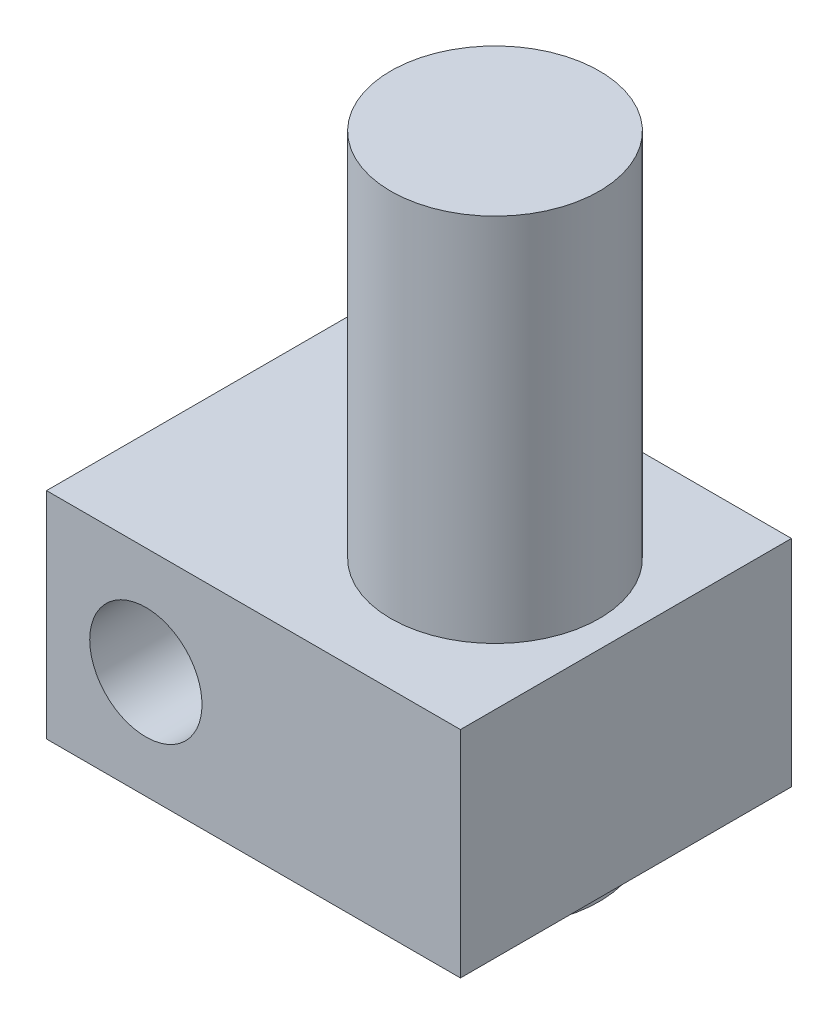
ISO-10303-21;
HEADER;
FILE_DESCRIPTION(('STEP AP214'),'2;1');
FILE_NAME('part.step','',(''),(''),'','','');
FILE_SCHEMA(('AUTOMOTIVE_DESIGN { 1 0 10303 214 1 1 1 1 }'));
ENDSEC;
DATA;
#1=APPLICATION_CONTEXT('core data for automotive mechanical design processes');
#2=APPLICATION_PROTOCOL_DEFINITION('international standard','automotive_design',2000,#1);
#3=PRODUCT_CONTEXT('',#1,'mechanical');
#4=PRODUCT('Part','Part','',(#3));
#5=PRODUCT_RELATED_PRODUCT_CATEGORY('part','',(#4));
#6=PRODUCT_DEFINITION_FORMATION('','',#4);
#7=PRODUCT_DEFINITION_CONTEXT('part definition',#1,'design');
#8=PRODUCT_DEFINITION('design','',#6,#7);
#9=PRODUCT_DEFINITION_SHAPE('','',#8);
#10=(LENGTH_UNIT() NAMED_UNIT(*) SI_UNIT(.MILLI.,.METRE.));
#11=(NAMED_UNIT(*) PLANE_ANGLE_UNIT() SI_UNIT($,.RADIAN.));
#12=(NAMED_UNIT(*) SI_UNIT($,.STERADIAN.) SOLID_ANGLE_UNIT());
#13=UNCERTAINTY_MEASURE_WITH_UNIT(LENGTH_MEASURE(1.E-05),#10,'distance_accuracy_value','');
#14=(GEOMETRIC_REPRESENTATION_CONTEXT(3) GLOBAL_UNCERTAINTY_ASSIGNED_CONTEXT((#13)) GLOBAL_UNIT_ASSIGNED_CONTEXT((#10,
#11,#12)) REPRESENTATION_CONTEXT('',''));
#15=CARTESIAN_POINT('',(0.,0.,0.));
#16=DIRECTION('',(0.,0.,1.));
#17=DIRECTION('',(1.,0.,0.));
#18=AXIS2_PLACEMENT_3D('',#15,#16,#17);
#19=CARTESIAN_POINT('',(7.94,8.255,-6.35));
#20=DIRECTION('',(-1.,0.,0.));
#21=DIRECTION('',(0.,0.,1.));
#22=AXIS2_PLACEMENT_3D('',#19,#20,#21);
#23=PLANE('',#22);
#24=DIRECTION('',(0.,0.,-1.));
#25=VECTOR('',#24,1.);
#26=CARTESIAN_POINT('',(7.94,0.,-6.35));
#27=LINE('',#26,#25);
#28=CARTESIAN_POINT('',(7.94,0.,6.35));
#29=VERTEX_POINT('',#28);
#30=CARTESIAN_POINT('',(7.94,0.,-6.35));
#31=VERTEX_POINT('',#30);
#32=EDGE_CURVE('E101',#29,#31,#27,.T.);
#33=ORIENTED_EDGE('',*,*,#32,.T.);
#34=DIRECTION('',(0.,-1.,0.));
#35=VECTOR('',#34,1.);
#36=CARTESIAN_POINT('',(7.94,8.255,-6.35));
#37=LINE('',#36,#35);
#38=CARTESIAN_POINT('',(7.94,8.255,-6.35));
#39=VERTEX_POINT('',#38);
#40=EDGE_CURVE('E92',#39,#31,#37,.T.);
#41=ORIENTED_EDGE('',*,*,#40,.F.);
#42=DIRECTION('',(0.,0.,-1.));
#43=VECTOR('',#42,1.);
#44=CARTESIAN_POINT('',(7.94,8.255,-6.35));
#45=LINE('',#44,#43);
#46=CARTESIAN_POINT('',(7.94,8.255,6.35));
#47=VERTEX_POINT('',#46);
#48=EDGE_CURVE('E86',#47,#39,#45,.T.);
#49=ORIENTED_EDGE('',*,*,#48,.F.);
#50=DIRECTION('',(0.,-1.,0.));
#51=VECTOR('',#50,1.);
#52=CARTESIAN_POINT('',(7.94,8.255,6.35));
#53=LINE('',#52,#51);
#54=EDGE_CURVE('E97',#47,#29,#53,.T.);
#55=ORIENTED_EDGE('',*,*,#54,.T.);
#56=EDGE_LOOP('',(#33,#41,#49,#55));
#57=FACE_BOUND('',#56,.T.);
#58=ADVANCED_FACE('F33',(#57),#23,.F.);
#59=CARTESIAN_POINT('',(-7.94,8.255,-6.35));
#60=DIRECTION('',(0.,0.,1.));
#61=DIRECTION('',(1.,0.,0.));
#62=AXIS2_PLACEMENT_3D('',#59,#60,#61);
#63=PLANE('',#62);
#64=CARTESIAN_POINT('',(-4.13,4.1275,-6.35));
#65=DIRECTION('',(0.,0.,-1.));
#66=DIRECTION('',(-1.,0.,0.));
#67=AXIS2_PLACEMENT_3D('',#64,#65,#66);
#68=CIRCLE('',#67,2.1533637066541);
#69=CARTESIAN_POINT('',(-6.28336370665411,4.1275,-6.35));
#70=VERTEX_POINT('',#69);
#71=EDGE_CURVE('E128',#70,#70,#68,.T.);
#72=ORIENTED_EDGE('',*,*,#71,.F.);
#73=EDGE_LOOP('',(#72));
#74=FACE_BOUND('',#73,.T.);
#75=DIRECTION('',(-1.,0.,0.));
#76=VECTOR('',#75,1.);
#77=CARTESIAN_POINT('',(-7.94,0.,-6.35));
#78=LINE('',#77,#76);
#79=CARTESIAN_POINT('',(-7.94,0.,-6.35));
#80=VERTEX_POINT('',#79);
#81=EDGE_CURVE('E91',#31,#80,#78,.T.);
#82=ORIENTED_EDGE('',*,*,#81,.T.);
#83=DIRECTION('',(0.,-1.,0.));
#84=VECTOR('',#83,1.);
#85=CARTESIAN_POINT('',(-7.94,8.255,-6.35));
#86=LINE('',#85,#84);
#87=CARTESIAN_POINT('',(-7.94,8.255,-6.35));
#88=VERTEX_POINT('',#87);
#89=EDGE_CURVE('E89',#88,#80,#86,.T.);
#90=ORIENTED_EDGE('',*,*,#89,.F.);
#91=DIRECTION('',(-1.,0.,0.));
#92=VECTOR('',#91,1.);
#93=CARTESIAN_POINT('',(-7.94,8.255,-6.35));
#94=LINE('',#93,#92);
#95=EDGE_CURVE('E81',#39,#88,#94,.T.);
#96=ORIENTED_EDGE('',*,*,#95,.F.);
#97=ORIENTED_EDGE('',*,*,#40,.T.);
#98=EDGE_LOOP('',(#82,#90,#96,#97));
#99=FACE_BOUND('',#98,.T.);
#100=ADVANCED_FACE('F90',(#74,#99),#63,.F.);
#101=CARTESIAN_POINT('',(-7.94,8.255,-6.35));
#102=DIRECTION('',(1.,0.,0.));
#103=DIRECTION('',(0.,0.,-1.));
#104=AXIS2_PLACEMENT_3D('',#101,#102,#103);
#105=PLANE('',#104);
#106=DIRECTION('',(0.,0.,1.));
#107=VECTOR('',#106,1.);
#108=CARTESIAN_POINT('',(-7.94,0.,-6.35));
#109=LINE('',#108,#107);
#110=CARTESIAN_POINT('',(-7.94000000000001,0.,6.35));
#111=VERTEX_POINT('',#110);
#112=EDGE_CURVE('E67',#80,#111,#109,.T.);
#113=ORIENTED_EDGE('',*,*,#112,.T.);
#114=DIRECTION('',(0.,-1.,0.));
#115=VECTOR('',#114,1.);
#116=CARTESIAN_POINT('',(-7.94000000000001,8.255,6.35));
#117=LINE('',#116,#115);
#118=CARTESIAN_POINT('',(-7.94000000000001,8.255,6.35));
#119=VERTEX_POINT('',#118);
#120=EDGE_CURVE('E93',#119,#111,#117,.T.);
#121=ORIENTED_EDGE('',*,*,#120,.F.);
#122=DIRECTION('',(0.,0.,1.));
#123=VECTOR('',#122,1.);
#124=CARTESIAN_POINT('',(-7.94,8.255,-6.35));
#125=LINE('',#124,#123);
#126=EDGE_CURVE('E84',#88,#119,#125,.T.);
#127=ORIENTED_EDGE('',*,*,#126,.F.);
#128=ORIENTED_EDGE('',*,*,#89,.T.);
#129=EDGE_LOOP('',(#113,#121,#127,#128));
#130=FACE_BOUND('',#129,.T.);
#131=ADVANCED_FACE('F95',(#130),#105,.F.);
#132=CARTESIAN_POINT('',(-7.94000000000001,8.255,6.35));
#133=DIRECTION('',(0.,0.,-1.));
#134=DIRECTION('',(-1.,0.,0.));
#135=AXIS2_PLACEMENT_3D('',#132,#133,#134);
#136=PLANE('',#135);
#137=CARTESIAN_POINT('',(-4.13,4.1275,6.35));
#138=DIRECTION('',(0.,0.,-1.));
#139=DIRECTION('',(-1.,0.,0.));
#140=AXIS2_PLACEMENT_3D('',#137,#138,#139);
#141=CIRCLE('',#140,2.1533637066541);
#142=CARTESIAN_POINT('',(-6.28336370665411,4.1275,6.35));
#143=VERTEX_POINT('',#142);
#144=EDGE_CURVE('E127',#143,#143,#141,.T.);
#145=ORIENTED_EDGE('',*,*,#144,.T.);
#146=EDGE_LOOP('',(#145));
#147=FACE_BOUND('',#146,.T.);
#148=DIRECTION('',(1.,0.,0.));
#149=VECTOR('',#148,1.);
#150=CARTESIAN_POINT('',(-7.94000000000001,0.,6.35));
#151=LINE('',#150,#149);
#152=EDGE_CURVE('E73',#111,#29,#151,.T.);
#153=ORIENTED_EDGE('',*,*,#152,.T.);
#154=ORIENTED_EDGE('',*,*,#54,.F.);
#155=DIRECTION('',(1.,0.,0.));
#156=VECTOR('',#155,1.);
#157=CARTESIAN_POINT('',(-7.94000000000001,8.255,6.35));
#158=LINE('',#157,#156);
#159=EDGE_CURVE('E50',#119,#47,#158,.T.);
#160=ORIENTED_EDGE('',*,*,#159,.F.);
#161=ORIENTED_EDGE('',*,*,#120,.T.);
#162=EDGE_LOOP('',(#153,#154,#160,#161));
#163=FACE_BOUND('',#162,.T.);
#164=ADVANCED_FACE('F134',(#147,#163),#136,.F.);
#165=CARTESIAN_POINT('',(0.,8.255,0.));
#166=DIRECTION('',(0.,1.,0.));
#167=DIRECTION('',(0.,0.,1.));
#168=AXIS2_PLACEMENT_3D('',#165,#166,#167);
#169=PLANE('',#168);
#170=CARTESIAN_POINT('',(2.917,8.255,0.));
#171=DIRECTION('',(0.,1.,0.));
#172=DIRECTION('',(0.,0.,1.));
#173=AXIS2_PLACEMENT_3D('',#170,#171,#172);
#174=CIRCLE('',#173,4.);
#175=CARTESIAN_POINT('',(2.917,8.255,4.));
#176=VERTEX_POINT('',#175);
#177=EDGE_CURVE('E111',#176,#176,#174,.T.);
#178=ORIENTED_EDGE('',*,*,#177,.F.);
#179=EDGE_LOOP('',(#178));
#180=FACE_BOUND('',#179,.T.);
#181=ORIENTED_EDGE('',*,*,#48,.T.);
#182=ORIENTED_EDGE('',*,*,#95,.T.);
#183=ORIENTED_EDGE('',*,*,#126,.T.);
#184=ORIENTED_EDGE('',*,*,#159,.T.);
#185=EDGE_LOOP('',(#181,#182,#183,#184));
#186=FACE_BOUND('',#185,.T.);
#187=ADVANCED_FACE('F82',(#180,#186),#169,.T.);
#188=CARTESIAN_POINT('',(0.,0.,0.));
#189=DIRECTION('',(0.,1.,0.));
#190=DIRECTION('',(0.,0.,1.));
#191=AXIS2_PLACEMENT_3D('',#188,#189,#190);
#192=PLANE('',#191);
#193=CARTESIAN_POINT('',(2.917,0.,0.));
#194=DIRECTION('',(0.,1.,0.));
#195=DIRECTION('',(0.,0.,1.));
#196=AXIS2_PLACEMENT_3D('',#193,#194,#195);
#197=CIRCLE('',#196,4.);
#198=CARTESIAN_POINT('',(2.917,0.,4.));
#199=VERTEX_POINT('',#198);
#200=EDGE_CURVE('E104',#199,#199,#197,.T.);
#201=ORIENTED_EDGE('',*,*,#200,.T.);
#202=EDGE_LOOP('',(#201));
#203=FACE_BOUND('',#202,.T.);
#204=ORIENTED_EDGE('',*,*,#32,.F.);
#205=ORIENTED_EDGE('',*,*,#152,.F.);
#206=ORIENTED_EDGE('',*,*,#112,.F.);
#207=ORIENTED_EDGE('',*,*,#81,.F.);
#208=EDGE_LOOP('',(#204,#205,#206,#207));
#209=FACE_BOUND('',#208,.T.);
#210=ADVANCED_FACE('F154',(#203,#209),#192,.F.);
#211=CARTESIAN_POINT('',(2.917,-2.745,0.));
#212=DIRECTION('',(0.,1.,0.));
#213=DIRECTION('',(0.,0.,1.));
#214=AXIS2_PLACEMENT_3D('',#211,#212,#213);
#215=CYLINDRICAL_SURFACE('',#214,4.);
#216=CARTESIAN_POINT('',(2.917,-1.14987170501556,0.));
#217=DIRECTION('',(0.,1.,0.));
#218=DIRECTION('',(0.,0.,1.));
#219=AXIS2_PLACEMENT_3D('',#216,#217,#218);
#220=CIRCLE('',#219,4.);
#221=CARTESIAN_POINT('',(2.917,-1.14987170501556,4.));
#222=VERTEX_POINT('',#221);
#223=EDGE_CURVE('E42',#222,#222,#220,.T.);
#224=ORIENTED_EDGE('',*,*,#223,.T.);
#225=EDGE_LOOP('',(#224));
#226=FACE_BOUND('',#225,.T.);
#227=ORIENTED_EDGE('',*,*,#200,.F.);
#228=EDGE_LOOP('',(#227));
#229=FACE_BOUND('',#228,.T.);
#230=ADVANCED_FACE('F157',(#226,#229),#215,.T.);
#231=ORIENTED_EDGE('',*,*,#177,.T.);
#232=EDGE_LOOP('',(#231));
#233=FACE_BOUND('',#232,.T.);
#234=CARTESIAN_POINT('',(2.917,22.455,0.));
#235=DIRECTION('',(0.,1.,0.));
#236=DIRECTION('',(0.,0.,1.));
#237=AXIS2_PLACEMENT_3D('',#234,#235,#236);
#238=CIRCLE('',#237,4.);
#239=CARTESIAN_POINT('',(2.917,22.455,4.));
#240=VERTEX_POINT('',#239);
#241=EDGE_CURVE('E113',#240,#240,#238,.T.);
#242=ORIENTED_EDGE('',*,*,#241,.F.);
#243=EDGE_LOOP('',(#242));
#244=FACE_BOUND('',#243,.T.);
#245=ADVANCED_FACE('F162',(#233,#244),#215,.T.);
#246=CARTESIAN_POINT('',(2.917,22.455,0.));
#247=DIRECTION('',(0.,1.,0.));
#248=DIRECTION('',(0.,0.,1.));
#249=AXIS2_PLACEMENT_3D('',#246,#247,#248);
#250=PLANE('',#249);
#251=ORIENTED_EDGE('',*,*,#241,.T.);
#252=EDGE_LOOP('',(#251));
#253=FACE_BOUND('',#252,.T.);
#254=ADVANCED_FACE('F165',(#253),#250,.T.);
#255=CARTESIAN_POINT('',(2.917,-1.14987170501556,0.));
#256=DIRECTION('',(0.,1.,0.));
#257=DIRECTION('',(0.,0.,1.));
#258=AXIS2_PLACEMENT_3D('',#255,#256,#257);
#259=CONICAL_SURFACE('',#258,4.,1.08210413623649);
#260=CARTESIAN_POINT('',(2.917,-2.745,0.));
#261=DIRECTION('',(0.,1.,0.));
#262=DIRECTION('',(0.,0.,1.));
#263=AXIS2_PLACEMENT_3D('',#260,#261,#262);
#264=CIRCLE('',#263,0.999999999999984);
#265=CARTESIAN_POINT('',(2.917,-2.745,0.999999999999983));
#266=VERTEX_POINT('',#265);
#267=EDGE_CURVE('E11',#266,#266,#264,.F.);
#268=CARTESIAN_POINT('',(2.917,-2.745,0.999999999999983));
#269=CARTESIAN_POINT('',(2.917,-2.72838408026058,1.03124999999998));
#270=CARTESIAN_POINT('',(2.917,-2.71176816052116,1.06249999999998));
#271=CARTESIAN_POINT('',(2.917,-2.67853632104232,1.12499999999998));
#272=CARTESIAN_POINT('',(2.917,-2.6619204013029,1.15624999999998));
#273=CARTESIAN_POINT('',(2.917,-2.62868856182405,1.21874999999998));
#274=CARTESIAN_POINT('',(2.917,-2.61207264208463,1.24999999999998));
#275=CARTESIAN_POINT('',(2.917,-2.57884080260579,1.31249999999999));
#276=CARTESIAN_POINT('',(2.917,-2.56222488286637,1.34374999999999));
#277=CARTESIAN_POINT('',(2.917,-2.52899304338753,1.40624999999999));
#278=CARTESIAN_POINT('',(2.917,-2.5123771236481,1.43749999999999));
#279=CARTESIAN_POINT('',(2.917,-2.47914528416926,1.49999999999999));
#280=CARTESIAN_POINT('',(2.917,-2.46252936442984,1.53124999999999));
#281=CARTESIAN_POINT('',(2.917,-2.429297524951,1.59374999999999));
#282=CARTESIAN_POINT('',(2.917,-2.41268160521158,1.62499999999999));
#283=CARTESIAN_POINT('',(2.917,-2.37944976573273,1.68749999999999));
#284=CARTESIAN_POINT('',(2.917,-2.36283384599331,1.71874999999999));
#285=CARTESIAN_POINT('',(2.917,-2.32960200651447,1.78124999999999));
#286=CARTESIAN_POINT('',(2.917,-2.31298608677505,1.81249999999999));
#287=CARTESIAN_POINT('',(2.917,-2.27975424729621,1.87499999999999));
#288=CARTESIAN_POINT('',(2.917,-2.26313832755679,1.90624999999999));
#289=CARTESIAN_POINT('',(2.917,-2.22990648807794,1.96874999999999));
#290=CARTESIAN_POINT('',(2.917,-2.21329056833852,1.99999999999999));
#291=CARTESIAN_POINT('',(2.917,-2.18005872885968,2.06249999999999));
#292=CARTESIAN_POINT('',(2.917,-2.16344280912026,2.09374999999999));
#293=CARTESIAN_POINT('',(2.917,-2.13021096964142,2.15624999999999));
#294=CARTESIAN_POINT('',(2.917,-2.113595049902,2.18749999999999));
#295=CARTESIAN_POINT('',(2.917,-2.08036321042315,2.24999999999999));
#296=CARTESIAN_POINT('',(2.917,-2.06374729068373,2.28124999999999));
#297=CARTESIAN_POINT('',(2.917,-2.03051545120489,2.34374999999999));
#298=CARTESIAN_POINT('',(2.917,-2.01389953146547,2.37499999999999));
#299=CARTESIAN_POINT('',(2.917,-1.98066769198663,2.43749999999999));
#300=CARTESIAN_POINT('',(2.917,-1.9640517722472,2.46874999999999));
#301=CARTESIAN_POINT('',(2.917,-1.93081993276836,2.53124999999999));
#302=CARTESIAN_POINT('',(2.917,-1.91420401302894,2.56249999999999));
#303=CARTESIAN_POINT('',(2.917,-1.8809721735501,2.62499999999999));
#304=CARTESIAN_POINT('',(2.917,-1.86435625381068,2.65624999999999));
#305=CARTESIAN_POINT('',(2.917,-1.83112441433183,2.71874999999999));
#306=CARTESIAN_POINT('',(2.917,-1.81450849459241,2.74999999999999));
#307=CARTESIAN_POINT('',(2.917,-1.78127665511357,2.81249999999999));
#308=CARTESIAN_POINT('',(2.917,-1.76466073537415,2.84374999999999));
#309=CARTESIAN_POINT('',(2.917,-1.73142889589531,2.90624999999999));
#310=CARTESIAN_POINT('',(2.917,-1.71481297615589,2.9375));
#311=CARTESIAN_POINT('',(2.917,-1.68158113667704,3.));
#312=CARTESIAN_POINT('',(2.917,-1.66496521693762,3.03125));
#313=CARTESIAN_POINT('',(2.917,-1.63173337745878,3.09375));
#314=CARTESIAN_POINT('',(2.917,-1.61511745771936,3.125));
#315=CARTESIAN_POINT('',(2.917,-1.58188561824052,3.1875));
#316=CARTESIAN_POINT('',(2.917,-1.56526969850109,3.21875));
#317=CARTESIAN_POINT('',(2.917,-1.53203785902225,3.28125));
#318=CARTESIAN_POINT('',(2.917,-1.51542193928283,3.3125));
#319=CARTESIAN_POINT('',(2.917,-1.48219009980399,3.375));
#320=CARTESIAN_POINT('',(2.917,-1.46557418006457,3.40625));
#321=CARTESIAN_POINT('',(2.917,-1.43234234058573,3.46875));
#322=CARTESIAN_POINT('',(2.917,-1.4157264208463,3.5));
#323=CARTESIAN_POINT('',(2.917,-1.38249458136746,3.5625));
#324=CARTESIAN_POINT('',(2.917,-1.36587866162804,3.59375));
#325=CARTESIAN_POINT('',(2.917,-1.3326468221492,3.65625));
#326=CARTESIAN_POINT('',(2.917,-1.31603090240978,3.6875));
#327=CARTESIAN_POINT('',(2.917,-1.28279906293093,3.75));
#328=CARTESIAN_POINT('',(2.917,-1.26618314319151,3.78125));
#329=CARTESIAN_POINT('',(2.917,-1.23295130371267,3.84375));
#330=CARTESIAN_POINT('',(2.917,-1.21633538397325,3.875));
#331=CARTESIAN_POINT('',(2.917,-1.18310354449441,3.9375));
#332=CARTESIAN_POINT('',(2.917,-1.16648762475499,3.96875));
#333=CARTESIAN_POINT('',(2.917,-1.14987170501556,4.));
#334=B_SPLINE_CURVE_WITH_KNOTS('',3,(#268,#269,#270,#271,#272,#273,#274,#275,#276,#277,#278,
#279,#280,#281,#282,#283,#284,#285,#286,#287,#288,#289,#290,#291,#292,#293,#294,#295,#296,#297,
#298,#299,#300,#301,#302,#303,#304,#305,#306,#307,#308,#309,#310,#311,#312,#313,#314,#315,#316,
#317,#318,#319,#320,#321,#322,#323,#324,#325,#326,#327,#328,#329,#330,#331,#332,#333),
.UNSPECIFIED.,.F.,.F.,(4,2,2,2,2,2,2,2,2,2,2,2,2,2,2,2,2,2,2,2,2,2,2,2,2,2,2,2,2,2,2,2,4),(0.,
0.106178442252098,0.212356884504196,0.318535326756294,0.424713769008392,0.53089221126049,
0.637070653512588,0.743249095764686,0.849427538016783,0.955605980268881,1.06178442252098,
1.16796286477308,1.27414130702517,1.38031974927727,1.48649819152937,1.59267663378147,
1.69885507603357,1.80503351828566,1.91121196053776,2.01739040278986,2.12356884504196,
2.22974728729406,2.33592572954615,2.44210417179825,2.54828261405035,2.65446105630245,
2.76063949855455,2.86681794080664,2.97299638305874,3.07917482531084,3.18535326756294,
3.29153170981504,3.39771015206714),.UNSPECIFIED.);
#335=EDGE_CURVE('BSEAM35',#266,#222,#334,.T.);
#336=ORIENTED_EDGE('',*,*,#267,.F.);
#337=ORIENTED_EDGE('',*,*,#223,.F.);
#338=ORIENTED_EDGE('',*,*,#335,.T.);
#339=ORIENTED_EDGE('',*,*,#335,.F.);
#340=EDGE_LOOP('',(#336,#338,#337,#339));
#341=FACE_BOUND('',#340,.T.);
#342=ADVANCED_FACE('F35',(#341),#259,.T.);
#343=CARTESIAN_POINT('',(2.917,-3.245,0.));
#344=DIRECTION('',(0.,1.,0.));
#345=DIRECTION('',(0.,0.,1.));
#346=AXIS2_PLACEMENT_3D('',#343,#344,#345);
#347=CYLINDRICAL_SURFACE('',#346,0.999999999999984);
#348=CARTESIAN_POINT('',(2.917,-3.245,0.));
#349=DIRECTION('',(0.,-1.,0.));
#350=DIRECTION('',(0.,0.,-1.));
#351=AXIS2_PLACEMENT_3D('',#348,#349,#350);
#352=CIRCLE('',#351,0.999999999999984);
#353=CARTESIAN_POINT('',(2.917,-3.245,-0.999999999999983));
#354=VERTEX_POINT('',#353);
#355=EDGE_CURVE('E124',#354,#354,#352,.T.);
#356=ORIENTED_EDGE('',*,*,#355,.F.);
#357=EDGE_LOOP('',(#356));
#358=FACE_BOUND('',#357,.T.);
#359=ORIENTED_EDGE('',*,*,#267,.T.);
#360=EDGE_LOOP('',(#359));
#361=FACE_BOUND('',#360,.T.);
#362=ADVANCED_FACE('F169',(#358,#361),#347,.T.);
#363=CARTESIAN_POINT('',(2.917,-3.245,0.));
#364=DIRECTION('',(0.,-1.,0.));
#365=DIRECTION('',(0.,0.,-1.));
#366=AXIS2_PLACEMENT_3D('',#363,#364,#365);
#367=PLANE('',#366);
#368=ORIENTED_EDGE('',*,*,#355,.T.);
#369=EDGE_LOOP('',(#368));
#370=FACE_BOUND('',#369,.T.);
#371=ADVANCED_FACE('F139',(#370),#367,.T.);
#372=CARTESIAN_POINT('',(-4.13,4.1275,6.35));
#373=DIRECTION('',(0.,0.,-1.));
#374=DIRECTION('',(-1.,0.,0.));
#375=AXIS2_PLACEMENT_3D('',#372,#373,#374);
#376=CYLINDRICAL_SURFACE('',#375,2.1533637066541);
#377=ORIENTED_EDGE('',*,*,#144,.F.);
#378=EDGE_LOOP('',(#377));
#379=FACE_BOUND('',#378,.T.);
#380=ORIENTED_EDGE('',*,*,#71,.T.);
#381=EDGE_LOOP('',(#380));
#382=FACE_BOUND('',#381,.T.);
#383=ADVANCED_FACE('F136',(#379,#382),#376,.F.);
#384=CLOSED_SHELL('',(#58,#100,#131,#164,#187,#210,#230,#245,#254,#342,#362,#371,#383));
#385=MANIFOLD_SOLID_BREP('B2',#384);
#386=ADVANCED_BREP_SHAPE_REPRESENTATION('',(#18,#385),#14);
#387=SHAPE_DEFINITION_REPRESENTATION(#9,#386);
ENDSEC;
END-ISO-10303-21;
